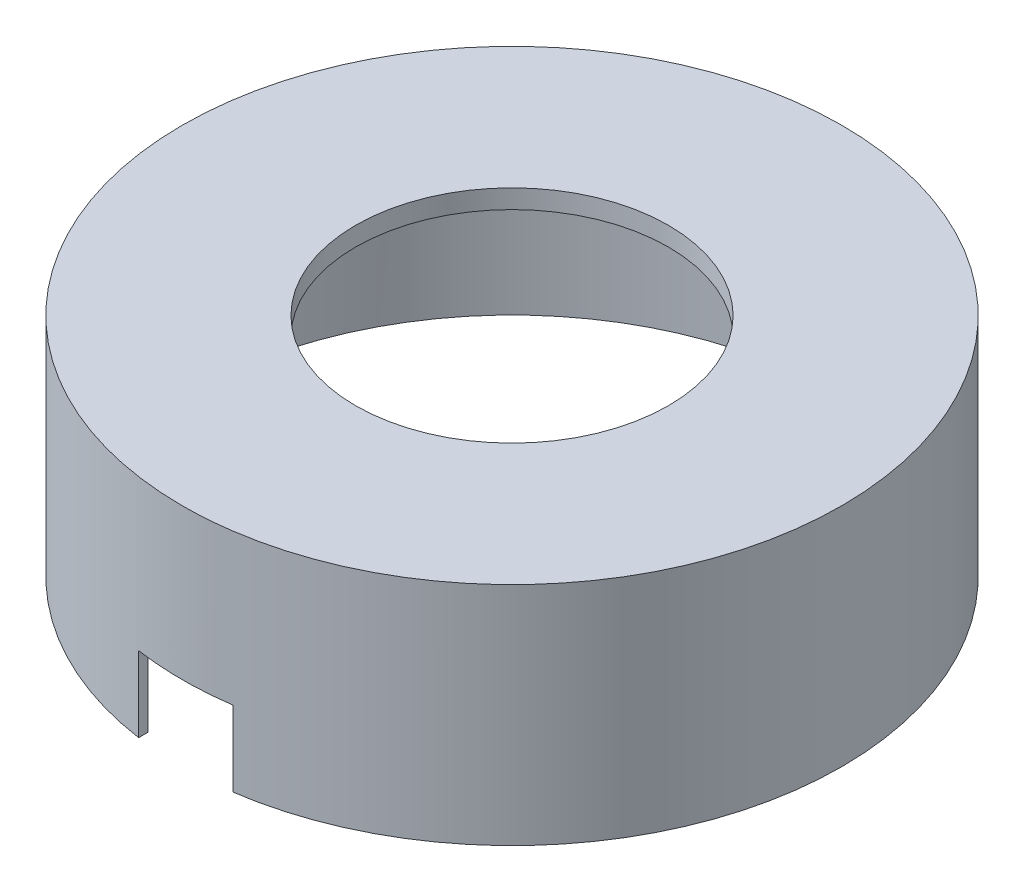
ISO-10303-21;
HEADER;
FILE_DESCRIPTION(('STEP AP214'),'2;1');
FILE_NAME('part.step','',(''),(''),'','','');
FILE_SCHEMA(('AUTOMOTIVE_DESIGN { 1 0 10303 214 1 1 1 1 }'));
ENDSEC;
DATA;
#1=APPLICATION_CONTEXT('core data for automotive mechanical design processes');
#2=APPLICATION_PROTOCOL_DEFINITION('international standard','automotive_design',2000,#1);
#3=PRODUCT_CONTEXT('',#1,'mechanical');
#4=PRODUCT('Part','Part','',(#3));
#5=PRODUCT_RELATED_PRODUCT_CATEGORY('part','',(#4));
#6=PRODUCT_DEFINITION_FORMATION('','',#4);
#7=PRODUCT_DEFINITION_CONTEXT('part definition',#1,'design');
#8=PRODUCT_DEFINITION('design','',#6,#7);
#9=PRODUCT_DEFINITION_SHAPE('','',#8);
#10=(LENGTH_UNIT() NAMED_UNIT(*) SI_UNIT(.MILLI.,.METRE.));
#11=(NAMED_UNIT(*) PLANE_ANGLE_UNIT() SI_UNIT($,.RADIAN.));
#12=(NAMED_UNIT(*) SI_UNIT($,.STERADIAN.) SOLID_ANGLE_UNIT());
#13=UNCERTAINTY_MEASURE_WITH_UNIT(LENGTH_MEASURE(1.E-05),#10,'distance_accuracy_value','');
#14=(GEOMETRIC_REPRESENTATION_CONTEXT(3) GLOBAL_UNCERTAINTY_ASSIGNED_CONTEXT((#13)) GLOBAL_UNIT_ASSIGNED_CONTEXT((#10,
#11,#12)) REPRESENTATION_CONTEXT('',''));
#15=CARTESIAN_POINT('',(0.,0.,0.));
#16=DIRECTION('',(0.,0.,1.));
#17=DIRECTION('',(1.,0.,0.));
#18=AXIS2_PLACEMENT_3D('',#15,#16,#17);
#19=CARTESIAN_POINT('',(0.,60.,0.));
#20=DIRECTION('',(0.,-1.,0.));
#21=DIRECTION('',(0.,0.,-1.));
#22=AXIS2_PLACEMENT_3D('',#19,#20,#21);
#23=CYLINDRICAL_SURFACE('',#22,87.5);
#24=CARTESIAN_POINT('',(0.,46.5053122559871,0.));
#25=DIRECTION('',(0.,-1.,0.));
#26=DIRECTION('',(0.,0.,-1.));
#27=AXIS2_PLACEMENT_3D('',#24,#25,#26);
#28=CIRCLE('',#27,87.5);
#29=CARTESIAN_POINT('',(-6.90000000000001,46.5053122559871,-87.2275185936181));
#30=VERTEX_POINT('',#29);
#31=CARTESIAN_POINT('',(-13.1,46.5053122559871,-86.5138139258697));
#32=VERTEX_POINT('',#31);
#33=EDGE_CURVE('E191',#30,#32,#28,.F.);
#34=ORIENTED_EDGE('',*,*,#33,.T.);
#35=DIRECTION('',(0.,-1.,0.));
#36=VECTOR('',#35,1.);
#37=CARTESIAN_POINT('',(-13.1,60.,-86.5138139258697));
#38=LINE('',#37,#36);
#39=CARTESIAN_POINT('',(-13.1,40.1116913967337,-86.5138139258697));
#40=VERTEX_POINT('',#39);
#41=EDGE_CURVE('E213',#32,#40,#38,.T.);
#42=ORIENTED_EDGE('',*,*,#41,.T.);
#43=CARTESIAN_POINT('',(0.,40.1116913967337,0.));
#44=DIRECTION('',(0.,1.,0.));
#45=DIRECTION('',(0.,0.,1.));
#46=AXIS2_PLACEMENT_3D('',#43,#44,#45);
#47=CIRCLE('',#46,87.5);
#48=CARTESIAN_POINT('',(-6.90000000000001,40.1116913967337,-87.2275185936181));
#49=VERTEX_POINT('',#48);
#50=EDGE_CURVE('E217',#40,#49,#47,.F.);
#51=ORIENTED_EDGE('',*,*,#50,.T.);
#52=DIRECTION('',(0.,-1.,0.));
#53=VECTOR('',#52,1.);
#54=CARTESIAN_POINT('',(-6.90000000000001,60.,-87.2275185936181));
#55=LINE('',#54,#53);
#56=EDGE_CURVE('E218',#49,#30,#55,.F.);
#57=ORIENTED_EDGE('',*,*,#56,.T.);
#58=EDGE_LOOP('',(#34,#42,#51,#57));
#59=FACE_BOUND('',#58,.T.);
#60=CARTESIAN_POINT('',(0.,60.,0.));
#61=DIRECTION('',(0.,1.,0.));
#62=DIRECTION('',(0.,0.,1.));
#63=AXIS2_PLACEMENT_3D('',#60,#61,#62);
#64=CIRCLE('',#63,87.5);
#65=CARTESIAN_POINT('',(0.,60.,87.5));
#66=VERTEX_POINT('',#65);
#67=EDGE_CURVE('E11',#66,#66,#64,.T.);
#68=ORIENTED_EDGE('',*,*,#67,.F.);
#69=EDGE_LOOP('',(#68));
#70=FACE_BOUND('',#69,.T.);
#71=CARTESIAN_POINT('',(0.,20.,0.));
#72=DIRECTION('',(0.,1.,0.));
#73=DIRECTION('',(-1.,0.,0.));
#74=AXIS2_PLACEMENT_3D('',#71,#72,#73);
#75=CIRCLE('',#74,87.5);
#76=CARTESIAN_POINT('',(12.5,20.,86.6025403784438));
#77=VERTEX_POINT('',#76);
#78=CARTESIAN_POINT('',(-12.5,20.,86.6025403784438));
#79=VERTEX_POINT('',#78);
#80=EDGE_CURVE('E232',#77,#79,#75,.F.);
#81=ORIENTED_EDGE('',*,*,#80,.F.);
#82=DIRECTION('',(0.,-1.,0.));
#83=VECTOR('',#82,1.);
#84=CARTESIAN_POINT('',(12.5,60.,86.6025403784438));
#85=LINE('',#84,#83);
#86=CARTESIAN_POINT('',(12.5,0.,86.6025403784438));
#87=VERTEX_POINT('',#86);
#88=EDGE_CURVE('E235',#87,#77,#85,.F.);
#89=ORIENTED_EDGE('',*,*,#88,.F.);
#90=CARTESIAN_POINT('',(0.,0.,0.));
#91=DIRECTION('',(0.,1.,0.));
#92=DIRECTION('',(0.,0.,1.));
#93=AXIS2_PLACEMENT_3D('',#90,#91,#92);
#94=CIRCLE('',#93,87.5);
#95=CARTESIAN_POINT('',(-12.5,0.,86.6025403784438));
#96=VERTEX_POINT('',#95);
#97=EDGE_CURVE('E46',#87,#96,#94,.T.);
#98=ORIENTED_EDGE('',*,*,#97,.T.);
#99=DIRECTION('',(0.,-1.,0.));
#100=VECTOR('',#99,1.);
#101=CARTESIAN_POINT('',(-12.5,60.,86.6025403784439));
#102=LINE('',#101,#100);
#103=EDGE_CURVE('E190',#79,#96,#102,.T.);
#104=ORIENTED_EDGE('',*,*,#103,.F.);
#105=EDGE_LOOP('',(#81,#89,#98,#104));
#106=FACE_BOUND('',#105,.T.);
#107=CARTESIAN_POINT('',(0.,46.5053122559871,0.));
#108=DIRECTION('',(0.,-1.,0.));
#109=DIRECTION('',(1.,0.,0.));
#110=AXIS2_PLACEMENT_3D('',#107,#108,#109);
#111=CIRCLE('',#110,87.5);
#112=CARTESIAN_POINT('',(13.1,46.5053122559871,-86.5138139258697));
#113=VERTEX_POINT('',#112);
#114=CARTESIAN_POINT('',(6.9,46.5053122559871,-87.2275185936181));
#115=VERTEX_POINT('',#114);
#116=EDGE_CURVE('E186',#113,#115,#111,.F.);
#117=ORIENTED_EDGE('',*,*,#116,.T.);
#118=DIRECTION('',(0.,-1.,0.));
#119=VECTOR('',#118,1.);
#120=CARTESIAN_POINT('',(6.9,60.,-87.2275185936181));
#121=LINE('',#120,#119);
#122=CARTESIAN_POINT('',(6.9,40.3053122559871,-87.2275185936181));
#123=VERTEX_POINT('',#122);
#124=EDGE_CURVE('E170',#115,#123,#121,.T.);
#125=ORIENTED_EDGE('',*,*,#124,.T.);
#126=CARTESIAN_POINT('',(0.,40.3053122559871,0.));
#127=DIRECTION('',(0.,1.,0.));
#128=DIRECTION('',(-1.,0.,0.));
#129=AXIS2_PLACEMENT_3D('',#126,#127,#128);
#130=CIRCLE('',#129,87.5);
#131=CARTESIAN_POINT('',(13.1,40.3053122559871,-86.5138139258697));
#132=VERTEX_POINT('',#131);
#133=EDGE_CURVE('E167',#123,#132,#130,.F.);
#134=ORIENTED_EDGE('',*,*,#133,.T.);
#135=DIRECTION('',(0.,-1.,0.));
#136=VECTOR('',#135,1.);
#137=CARTESIAN_POINT('',(13.1,60.,-86.5138139258697));
#138=LINE('',#137,#136);
#139=EDGE_CURVE('E149',#132,#113,#138,.F.);
#140=ORIENTED_EDGE('',*,*,#139,.T.);
#141=EDGE_LOOP('',(#117,#125,#134,#140));
#142=FACE_BOUND('',#141,.T.);
#143=ADVANCED_FACE('F43',(#59,#70,#106,#142),#23,.T.);
#144=CARTESIAN_POINT('',(0.,55.,0.));
#145=DIRECTION('',(0.,-1.,0.));
#146=DIRECTION('',(0.,0.,-1.));
#147=AXIS2_PLACEMENT_3D('',#144,#145,#146);
#148=CYLINDRICAL_SURFACE('',#147,85.);
#149=CARTESIAN_POINT('',(0.,46.5053122559871,0.));
#150=DIRECTION('',(0.,-1.,0.));
#151=DIRECTION('',(0.,0.,-1.));
#152=AXIS2_PLACEMENT_3D('',#149,#150,#151);
#153=CIRCLE('',#152,85.);
#154=CARTESIAN_POINT('',(-13.1,46.5053122559871,-83.9844628487913));
#155=VERTEX_POINT('',#154);
#156=CARTESIAN_POINT('',(-6.90000000000001,46.5053122559871,-84.7194782797911));
#157=VERTEX_POINT('',#156);
#158=EDGE_CURVE('E195',#155,#157,#153,.T.);
#159=ORIENTED_EDGE('',*,*,#158,.T.);
#160=DIRECTION('',(0.,-1.,0.));
#161=VECTOR('',#160,1.);
#162=CARTESIAN_POINT('',(-6.90000000000001,55.,-84.7194782797911));
#163=LINE('',#162,#161);
#164=CARTESIAN_POINT('',(-6.90000000000001,40.1116913967337,-84.7194782797911));
#165=VERTEX_POINT('',#164);
#166=EDGE_CURVE('E158',#157,#165,#163,.T.);
#167=ORIENTED_EDGE('',*,*,#166,.T.);
#168=CARTESIAN_POINT('',(0.,40.1116913967337,0.));
#169=DIRECTION('',(0.,1.,0.));
#170=DIRECTION('',(0.,0.,1.));
#171=AXIS2_PLACEMENT_3D('',#168,#169,#170);
#172=CIRCLE('',#171,85.);
#173=CARTESIAN_POINT('',(-13.1,40.1116913967337,-83.9844628487913));
#174=VERTEX_POINT('',#173);
#175=EDGE_CURVE('E162',#165,#174,#172,.T.);
#176=ORIENTED_EDGE('',*,*,#175,.T.);
#177=DIRECTION('',(0.,-1.,0.));
#178=VECTOR('',#177,1.);
#179=CARTESIAN_POINT('',(-13.1,55.,-83.9844628487913));
#180=LINE('',#179,#178);
#181=EDGE_CURVE('E222',#174,#155,#180,.F.);
#182=ORIENTED_EDGE('',*,*,#181,.T.);
#183=EDGE_LOOP('',(#159,#167,#176,#182));
#184=FACE_BOUND('',#183,.T.);
#185=CARTESIAN_POINT('',(0.,0.,0.));
#186=DIRECTION('',(0.,-1.,0.));
#187=DIRECTION('',(0.,0.,-1.));
#188=AXIS2_PLACEMENT_3D('',#185,#186,#187);
#189=CIRCLE('',#188,85.);
#190=CARTESIAN_POINT('',(-12.5,0.,84.0758586040012));
#191=VERTEX_POINT('',#190);
#192=CARTESIAN_POINT('',(12.5,0.,84.0758586040012));
#193=VERTEX_POINT('',#192);
#194=EDGE_CURVE('E270',#191,#193,#189,.T.);
#195=ORIENTED_EDGE('',*,*,#194,.T.);
#196=DIRECTION('',(0.,-1.,0.));
#197=VECTOR('',#196,1.);
#198=CARTESIAN_POINT('',(12.5,55.,84.0758586040012));
#199=LINE('',#198,#197);
#200=CARTESIAN_POINT('',(12.5,20.,84.0758586040012));
#201=VERTEX_POINT('',#200);
#202=EDGE_CURVE('E244',#201,#193,#199,.T.);
#203=ORIENTED_EDGE('',*,*,#202,.F.);
#204=CARTESIAN_POINT('',(0.,20.,0.));
#205=DIRECTION('',(0.,1.,0.));
#206=DIRECTION('',(-1.,0.,0.));
#207=AXIS2_PLACEMENT_3D('',#204,#205,#206);
#208=CIRCLE('',#207,85.);
#209=CARTESIAN_POINT('',(-12.5,20.,84.0758586040012));
#210=VERTEX_POINT('',#209);
#211=EDGE_CURVE('E251',#210,#201,#208,.T.);
#212=ORIENTED_EDGE('',*,*,#211,.F.);
#213=DIRECTION('',(0.,-1.,0.));
#214=VECTOR('',#213,1.);
#215=CARTESIAN_POINT('',(-12.5,55.,84.0758586040012));
#216=LINE('',#215,#214);
#217=EDGE_CURVE('E241',#191,#210,#216,.F.);
#218=ORIENTED_EDGE('',*,*,#217,.F.);
#219=EDGE_LOOP('',(#195,#203,#212,#218));
#220=FACE_BOUND('',#219,.T.);
#221=CARTESIAN_POINT('',(0.,55.,0.));
#222=DIRECTION('',(0.,-1.,0.));
#223=DIRECTION('',(0.,0.,-1.));
#224=AXIS2_PLACEMENT_3D('',#221,#222,#223);
#225=CIRCLE('',#224,85.);
#226=CARTESIAN_POINT('',(0.,55.,-85.));
#227=VERTEX_POINT('',#226);
#228=EDGE_CURVE('E274',#227,#227,#225,.T.);
#229=ORIENTED_EDGE('',*,*,#228,.F.);
#230=EDGE_LOOP('',(#229));
#231=FACE_BOUND('',#230,.T.);
#232=CARTESIAN_POINT('',(0.,46.5053122559871,0.));
#233=DIRECTION('',(0.,-1.,0.));
#234=DIRECTION('',(1.,0.,0.));
#235=AXIS2_PLACEMENT_3D('',#232,#233,#234);
#236=CIRCLE('',#235,85.);
#237=CARTESIAN_POINT('',(6.9,46.5053122559871,-84.7194782797911));
#238=VERTEX_POINT('',#237);
#239=CARTESIAN_POINT('',(13.1,46.5053122559871,-83.9844628487913));
#240=VERTEX_POINT('',#239);
#241=EDGE_CURVE('E156',#238,#240,#236,.T.);
#242=ORIENTED_EDGE('',*,*,#241,.T.);
#243=DIRECTION('',(0.,-1.,0.));
#244=VECTOR('',#243,1.);
#245=CARTESIAN_POINT('',(13.1,55.,-83.9844628487913));
#246=LINE('',#245,#244);
#247=CARTESIAN_POINT('',(13.1,40.3053122559871,-83.9844628487913));
#248=VERTEX_POINT('',#247);
#249=EDGE_CURVE('E142',#240,#248,#246,.T.);
#250=ORIENTED_EDGE('',*,*,#249,.T.);
#251=CARTESIAN_POINT('',(0.,40.3053122559871,0.));
#252=DIRECTION('',(0.,1.,0.));
#253=DIRECTION('',(-1.,0.,0.));
#254=AXIS2_PLACEMENT_3D('',#251,#252,#253);
#255=CIRCLE('',#254,85.);
#256=CARTESIAN_POINT('',(6.9,40.3053122559871,-84.7194782797911));
#257=VERTEX_POINT('',#256);
#258=EDGE_CURVE('E132',#248,#257,#255,.T.);
#259=ORIENTED_EDGE('',*,*,#258,.T.);
#260=DIRECTION('',(0.,-1.,0.));
#261=VECTOR('',#260,1.);
#262=CARTESIAN_POINT('',(6.9,55.,-84.7194782797911));
#263=LINE('',#262,#261);
#264=EDGE_CURVE('E141',#257,#238,#263,.F.);
#265=ORIENTED_EDGE('',*,*,#264,.T.);
#266=EDGE_LOOP('',(#242,#250,#259,#265));
#267=FACE_BOUND('',#266,.T.);
#268=ADVANCED_FACE('F154',(#184,#220,#231,#267),#148,.F.);
#269=CARTESIAN_POINT('',(0.,60.,0.));
#270=DIRECTION('',(0.,1.,0.));
#271=DIRECTION('',(0.,0.,1.));
#272=AXIS2_PLACEMENT_3D('',#269,#270,#271);
#273=PLANE('',#272);
#274=CARTESIAN_POINT('',(0.,60.,0.));
#275=DIRECTION('',(0.,1.,0.));
#276=DIRECTION('',(0.,0.,1.));
#277=AXIS2_PLACEMENT_3D('',#274,#275,#276);
#278=CIRCLE('',#277,41.5);
#279=CARTESIAN_POINT('',(0.,60.,41.5));
#280=VERTEX_POINT('',#279);
#281=EDGE_CURVE('E265',#280,#280,#278,.F.);
#282=ORIENTED_EDGE('',*,*,#281,.T.);
#283=EDGE_LOOP('',(#282));
#284=FACE_BOUND('',#283,.T.);
#285=ORIENTED_EDGE('',*,*,#67,.T.);
#286=EDGE_LOOP('',(#285));
#287=FACE_BOUND('',#286,.T.);
#288=ADVANCED_FACE('F319',(#284,#287),#273,.T.);
#289=CARTESIAN_POINT('',(0.,0.,0.));
#290=DIRECTION('',(0.,1.,0.));
#291=DIRECTION('',(0.,0.,1.));
#292=AXIS2_PLACEMENT_3D('',#289,#290,#291);
#293=PLANE('',#292);
#294=ORIENTED_EDGE('',*,*,#97,.F.);
#295=DIRECTION('',(0.,0.,1.));
#296=VECTOR('',#295,1.);
#297=CARTESIAN_POINT('',(12.5,0.,-87.501));
#298=LINE('',#297,#296);
#299=EDGE_CURVE('E248',#193,#87,#298,.T.);
#300=ORIENTED_EDGE('',*,*,#299,.F.);
#301=ORIENTED_EDGE('',*,*,#194,.F.);
#302=DIRECTION('',(0.,0.,1.));
#303=VECTOR('',#302,1.);
#304=CARTESIAN_POINT('',(-12.5,0.,-87.501));
#305=LINE('',#304,#303);
#306=EDGE_CURVE('E252',#191,#96,#305,.T.);
#307=ORIENTED_EDGE('',*,*,#306,.T.);
#308=EDGE_LOOP('',(#294,#300,#301,#307));
#309=FACE_BOUND('',#308,.T.);
#310=ADVANCED_FACE('F289',(#309),#293,.F.);
#311=CARTESIAN_POINT('',(0.,55.,0.));
#312=DIRECTION('',(0.,-1.,0.));
#313=DIRECTION('',(0.,0.,-1.));
#314=AXIS2_PLACEMENT_3D('',#311,#312,#313);
#315=PLANE('',#314);
#316=CARTESIAN_POINT('',(0.,55.,0.));
#317=DIRECTION('',(0.,-1.,0.));
#318=DIRECTION('',(0.,0.,-1.));
#319=AXIS2_PLACEMENT_3D('',#316,#317,#318);
#320=CIRCLE('',#319,41.5);
#321=CARTESIAN_POINT('',(0.,55.,-41.5));
#322=VERTEX_POINT('',#321);
#323=EDGE_CURVE('E266',#322,#322,#320,.T.);
#324=ORIENTED_EDGE('',*,*,#323,.F.);
#325=EDGE_LOOP('',(#324));
#326=FACE_BOUND('',#325,.T.);
#327=ORIENTED_EDGE('',*,*,#228,.T.);
#328=EDGE_LOOP('',(#327));
#329=FACE_BOUND('',#328,.T.);
#330=ADVANCED_FACE('F331',(#326,#329),#315,.T.);
#331=CARTESIAN_POINT('',(0.,60.001,0.));
#332=DIRECTION('',(0.,-1.,0.));
#333=DIRECTION('',(0.,0.,-1.));
#334=AXIS2_PLACEMENT_3D('',#331,#332,#333);
#335=CYLINDRICAL_SURFACE('',#334,41.5);
#336=ORIENTED_EDGE('',*,*,#281,.F.);
#337=EDGE_LOOP('',(#336));
#338=FACE_BOUND('',#337,.T.);
#339=ORIENTED_EDGE('',*,*,#323,.T.);
#340=EDGE_LOOP('',(#339));
#341=FACE_BOUND('',#340,.T.);
#342=ADVANCED_FACE('F311',(#338,#341),#335,.F.);
#343=CARTESIAN_POINT('',(12.5,20.,-87.501));
#344=DIRECTION('',(1.,0.,0.));
#345=DIRECTION('',(0.,1.,0.));
#346=AXIS2_PLACEMENT_3D('',#343,#344,#345);
#347=PLANE('',#346);
#348=ORIENTED_EDGE('',*,*,#88,.T.);
#349=DIRECTION('',(0.,0.,1.));
#350=VECTOR('',#349,1.);
#351=CARTESIAN_POINT('',(12.5,20.,-87.501));
#352=LINE('',#351,#350);
#353=EDGE_CURVE('E247',#201,#77,#352,.T.);
#354=ORIENTED_EDGE('',*,*,#353,.F.);
#355=ORIENTED_EDGE('',*,*,#202,.T.);
#356=ORIENTED_EDGE('',*,*,#299,.T.);
#357=EDGE_LOOP('',(#348,#354,#355,#356));
#358=FACE_BOUND('',#357,.T.);
#359=ADVANCED_FACE('F293',(#358),#347,.F.);
#360=CARTESIAN_POINT('',(-12.5,20.,-87.501));
#361=DIRECTION('',(-1.,0.,0.));
#362=DIRECTION('',(0.,-1.,0.));
#363=AXIS2_PLACEMENT_3D('',#360,#361,#362);
#364=PLANE('',#363);
#365=ORIENTED_EDGE('',*,*,#103,.T.);
#366=ORIENTED_EDGE('',*,*,#306,.F.);
#367=ORIENTED_EDGE('',*,*,#217,.T.);
#368=DIRECTION('',(0.,0.,1.));
#369=VECTOR('',#368,1.);
#370=CARTESIAN_POINT('',(-12.5,20.,-87.501));
#371=LINE('',#370,#369);
#372=EDGE_CURVE('E256',#210,#79,#371,.T.);
#373=ORIENTED_EDGE('',*,*,#372,.T.);
#374=EDGE_LOOP('',(#365,#366,#367,#373));
#375=FACE_BOUND('',#374,.T.);
#376=ADVANCED_FACE('F302',(#375),#364,.F.);
#377=CARTESIAN_POINT('',(-12.5,20.,-87.501));
#378=DIRECTION('',(0.,1.,0.));
#379=DIRECTION('',(-1.,0.,0.));
#380=AXIS2_PLACEMENT_3D('',#377,#378,#379);
#381=PLANE('',#380);
#382=ORIENTED_EDGE('',*,*,#80,.T.);
#383=ORIENTED_EDGE('',*,*,#372,.F.);
#384=ORIENTED_EDGE('',*,*,#211,.T.);
#385=ORIENTED_EDGE('',*,*,#353,.T.);
#386=EDGE_LOOP('',(#382,#383,#384,#385));
#387=FACE_BOUND('',#386,.T.);
#388=ADVANCED_FACE('F300',(#387),#381,.F.);
#389=CARTESIAN_POINT('',(-6.90000000000001,46.5053122559871,87.501));
#390=DIRECTION('',(0.,-1.,0.));
#391=DIRECTION('',(0.,0.,-1.));
#392=AXIS2_PLACEMENT_3D('',#389,#390,#391);
#393=PLANE('',#392);
#394=DIRECTION('',(0.,0.,-1.));
#395=VECTOR('',#394,1.);
#396=CARTESIAN_POINT('',(-6.90000000000001,46.5053122559871,87.501));
#397=LINE('',#396,#395);
#398=EDGE_CURVE('E205',#157,#30,#397,.T.);
#399=ORIENTED_EDGE('',*,*,#398,.F.);
#400=ORIENTED_EDGE('',*,*,#158,.F.);
#401=DIRECTION('',(0.,0.,-1.));
#402=VECTOR('',#401,1.);
#403=CARTESIAN_POINT('',(-13.1,46.5053122559871,87.501));
#404=LINE('',#403,#402);
#405=EDGE_CURVE('E209',#155,#32,#404,.T.);
#406=ORIENTED_EDGE('',*,*,#405,.T.);
#407=ORIENTED_EDGE('',*,*,#33,.F.);
#408=EDGE_LOOP('',(#399,#400,#406,#407));
#409=FACE_BOUND('',#408,.T.);
#410=ADVANCED_FACE('F309',(#409),#393,.T.);
#411=CARTESIAN_POINT('',(-6.90000000000001,46.5053122559871,87.501));
#412=DIRECTION('',(-1.,0.,0.));
#413=DIRECTION('',(0.,0.,1.));
#414=AXIS2_PLACEMENT_3D('',#411,#412,#413);
#415=PLANE('',#414);
#416=DIRECTION('',(0.,0.,-1.));
#417=VECTOR('',#416,1.);
#418=CARTESIAN_POINT('',(-6.90000000000001,40.1116913967337,87.501));
#419=LINE('',#418,#417);
#420=EDGE_CURVE('E201',#165,#49,#419,.T.);
#421=ORIENTED_EDGE('',*,*,#420,.F.);
#422=ORIENTED_EDGE('',*,*,#166,.F.);
#423=ORIENTED_EDGE('',*,*,#398,.T.);
#424=ORIENTED_EDGE('',*,*,#56,.F.);
#425=EDGE_LOOP('',(#421,#422,#423,#424));
#426=FACE_BOUND('',#425,.T.);
#427=ADVANCED_FACE('F388',(#426),#415,.T.);
#428=CARTESIAN_POINT('',(-6.90000000000001,40.1116913967337,87.501));
#429=DIRECTION('',(0.,1.,0.));
#430=DIRECTION('',(0.,0.,1.));
#431=AXIS2_PLACEMENT_3D('',#428,#429,#430);
#432=PLANE('',#431);
#433=DIRECTION('',(0.,0.,-1.));
#434=VECTOR('',#433,1.);
#435=CARTESIAN_POINT('',(-13.1,40.1116913967337,87.501));
#436=LINE('',#435,#434);
#437=EDGE_CURVE('E66',#174,#40,#436,.T.);
#438=ORIENTED_EDGE('',*,*,#437,.F.);
#439=ORIENTED_EDGE('',*,*,#175,.F.);
#440=ORIENTED_EDGE('',*,*,#420,.T.);
#441=ORIENTED_EDGE('',*,*,#50,.F.);
#442=EDGE_LOOP('',(#438,#439,#440,#441));
#443=FACE_BOUND('',#442,.T.);
#444=ADVANCED_FACE('F398',(#443),#432,.T.);
#445=CARTESIAN_POINT('',(-13.1,46.5053122559871,87.501));
#446=DIRECTION('',(1.,0.,0.));
#447=DIRECTION('',(0.,1.,0.));
#448=AXIS2_PLACEMENT_3D('',#445,#446,#447);
#449=PLANE('',#448);
#450=ORIENTED_EDGE('',*,*,#405,.F.);
#451=ORIENTED_EDGE('',*,*,#181,.F.);
#452=ORIENTED_EDGE('',*,*,#437,.T.);
#453=ORIENTED_EDGE('',*,*,#41,.F.);
#454=EDGE_LOOP('',(#450,#451,#452,#453));
#455=FACE_BOUND('',#454,.T.);
#456=ADVANCED_FACE('F409',(#455),#449,.T.);
#457=CARTESIAN_POINT('',(13.1,46.5053122559871,87.501));
#458=DIRECTION('',(0.,-1.,0.));
#459=DIRECTION('',(1.,0.,0.));
#460=AXIS2_PLACEMENT_3D('',#457,#458,#459);
#461=PLANE('',#460);
#462=DIRECTION('',(0.,0.,-1.));
#463=VECTOR('',#462,1.);
#464=CARTESIAN_POINT('',(13.1,46.5053122559871,87.501));
#465=LINE('',#464,#463);
#466=EDGE_CURVE('E151',#240,#113,#465,.T.);
#467=ORIENTED_EDGE('',*,*,#466,.F.);
#468=ORIENTED_EDGE('',*,*,#241,.F.);
#469=DIRECTION('',(0.,0.,-1.));
#470=VECTOR('',#469,1.);
#471=CARTESIAN_POINT('',(6.9,46.5053122559871,87.501));
#472=LINE('',#471,#470);
#473=EDGE_CURVE('E176',#238,#115,#472,.T.);
#474=ORIENTED_EDGE('',*,*,#473,.T.);
#475=ORIENTED_EDGE('',*,*,#116,.F.);
#476=EDGE_LOOP('',(#467,#468,#474,#475));
#477=FACE_BOUND('',#476,.T.);
#478=ADVANCED_FACE('F420',(#477),#461,.T.);
#479=CARTESIAN_POINT('',(13.1,46.5053122559871,87.501));
#480=DIRECTION('',(-1.,0.,0.));
#481=DIRECTION('',(0.,-1.,0.));
#482=AXIS2_PLACEMENT_3D('',#479,#480,#481);
#483=PLANE('',#482);
#484=DIRECTION('',(0.,0.,-1.));
#485=VECTOR('',#484,1.);
#486=CARTESIAN_POINT('',(13.1,40.3053122559871,87.501));
#487=LINE('',#486,#485);
#488=EDGE_CURVE('E135',#248,#132,#487,.T.);
#489=ORIENTED_EDGE('',*,*,#488,.F.);
#490=ORIENTED_EDGE('',*,*,#249,.F.);
#491=ORIENTED_EDGE('',*,*,#466,.T.);
#492=ORIENTED_EDGE('',*,*,#139,.F.);
#493=EDGE_LOOP('',(#489,#490,#491,#492));
#494=FACE_BOUND('',#493,.T.);
#495=ADVANCED_FACE('F145',(#494),#483,.T.);
#496=CARTESIAN_POINT('',(13.1,40.3053122559871,87.501));
#497=DIRECTION('',(0.,1.,0.));
#498=DIRECTION('',(-1.,0.,0.));
#499=AXIS2_PLACEMENT_3D('',#496,#497,#498);
#500=PLANE('',#499);
#501=DIRECTION('',(0.,0.,-1.));
#502=VECTOR('',#501,1.);
#503=CARTESIAN_POINT('',(6.9,40.3053122559871,87.501));
#504=LINE('',#503,#502);
#505=EDGE_CURVE('E58',#257,#123,#504,.T.);
#506=ORIENTED_EDGE('',*,*,#505,.F.);
#507=ORIENTED_EDGE('',*,*,#258,.F.);
#508=ORIENTED_EDGE('',*,*,#488,.T.);
#509=ORIENTED_EDGE('',*,*,#133,.F.);
#510=EDGE_LOOP('',(#506,#507,#508,#509));
#511=FACE_BOUND('',#510,.T.);
#512=ADVANCED_FACE('F134',(#511),#500,.T.);
#513=CARTESIAN_POINT('',(6.9,46.5053122559871,87.501));
#514=DIRECTION('',(1.,0.,0.));
#515=DIRECTION('',(0.,0.,-1.));
#516=AXIS2_PLACEMENT_3D('',#513,#514,#515);
#517=PLANE('',#516);
#518=ORIENTED_EDGE('',*,*,#473,.F.);
#519=ORIENTED_EDGE('',*,*,#264,.F.);
#520=ORIENTED_EDGE('',*,*,#505,.T.);
#521=ORIENTED_EDGE('',*,*,#124,.F.);
#522=EDGE_LOOP('',(#518,#519,#520,#521));
#523=FACE_BOUND('',#522,.T.);
#524=ADVANCED_FACE('F449',(#523),#517,.T.);
#525=CLOSED_SHELL('',(#143,#268,#288,#310,#330,#342,#359,#376,#388,#410,#427,#444,#456,#478,
#495,#512,#524));
#526=MANIFOLD_SOLID_BREP('B2',#525);
#527=ADVANCED_BREP_SHAPE_REPRESENTATION('',(#18,#526),#14);
#528=SHAPE_DEFINITION_REPRESENTATION(#9,#527);
ENDSEC;
END-ISO-10303-21;
